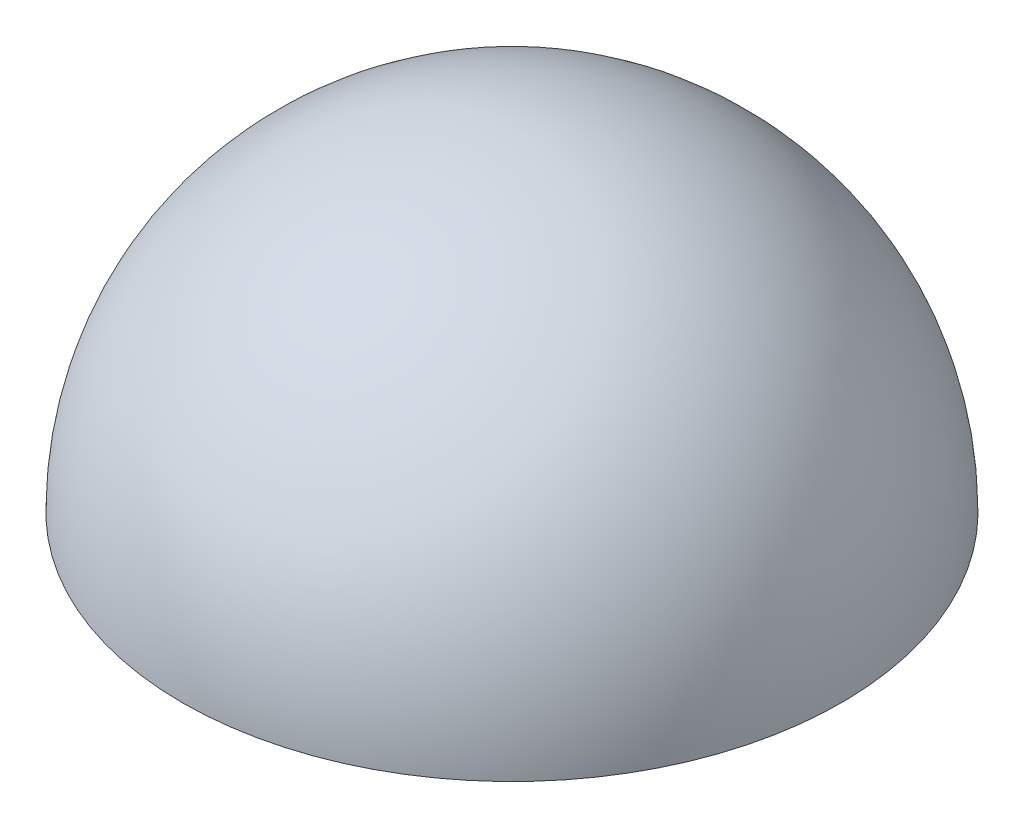
ISO-10303-21;
HEADER;
FILE_DESCRIPTION(('STEP AP214'),'2;1');
FILE_NAME('part.step','',(''),(''),'','','');
FILE_SCHEMA(('AUTOMOTIVE_DESIGN { 1 0 10303 214 1 1 1 1 }'));
ENDSEC;
DATA;
#1=APPLICATION_CONTEXT('core data for automotive mechanical design processes');
#2=APPLICATION_PROTOCOL_DEFINITION('international standard','automotive_design',2000,#1);
#3=PRODUCT_CONTEXT('',#1,'mechanical');
#4=PRODUCT('Part','Part','',(#3));
#5=PRODUCT_RELATED_PRODUCT_CATEGORY('part','',(#4));
#6=PRODUCT_DEFINITION_FORMATION('','',#4);
#7=PRODUCT_DEFINITION_CONTEXT('part definition',#1,'design');
#8=PRODUCT_DEFINITION('design','',#6,#7);
#9=PRODUCT_DEFINITION_SHAPE('','',#8);
#10=(LENGTH_UNIT() NAMED_UNIT(*) SI_UNIT(.MILLI.,.METRE.));
#11=(NAMED_UNIT(*) PLANE_ANGLE_UNIT() SI_UNIT($,.RADIAN.));
#12=(NAMED_UNIT(*) SI_UNIT($,.STERADIAN.) SOLID_ANGLE_UNIT());
#13=UNCERTAINTY_MEASURE_WITH_UNIT(LENGTH_MEASURE(1.E-05),#10,'distance_accuracy_value','');
#14=(GEOMETRIC_REPRESENTATION_CONTEXT(3) GLOBAL_UNCERTAINTY_ASSIGNED_CONTEXT((#13)) GLOBAL_UNIT_ASSIGNED_CONTEXT((#10,
#11,#12)) REPRESENTATION_CONTEXT('',''));
#15=CARTESIAN_POINT('',(0.,0.,0.));
#16=DIRECTION('',(0.,0.,1.));
#17=DIRECTION('',(1.,0.,0.));
#18=AXIS2_PLACEMENT_3D('',#15,#16,#17);
#19=CARTESIAN_POINT('',(0.,0.,0.));
#20=DIRECTION('',(-1.,0.,0.));
#21=DIRECTION('',(0.,1.,0.));
#22=AXIS2_PLACEMENT_3D('',#19,#20,#21);
#23=SPHERICAL_SURFACE('',#22,50.);
#24=CARTESIAN_POINT('',(0.,0.,0.));
#25=DIRECTION('',(0.,1.,0.));
#26=DIRECTION('',(0.,0.,1.));
#27=AXIS2_PLACEMENT_3D('',#24,#25,#26);
#28=SPHERICAL_SURFACE('',#27,50.);
#29=CARTESIAN_POINT('',(0.,0.,0.));
#30=DIRECTION('',(0.,1.,0.));
#31=DIRECTION('',(0.,0.,1.));
#32=AXIS2_PLACEMENT_3D('',#29,#30,#31);
#33=CIRCLE('',#32,50.);
#34=CARTESIAN_POINT('',(0.,0.,50.));
#35=VERTEX_POINT('',#34);
#36=EDGE_CURVE('E10',#35,#35,#33,.T.);
#37=ORIENTED_EDGE('',*,*,#36,.T.);
#38=EDGE_LOOP('',(#37));
#39=FACE_BOUND('',#38,.T.);
#40=ADVANCED_FACE('F39',(#39),#28,.T.);
#41=CARTESIAN_POINT('',(-63.0643694772417,0.,-50.));
#42=DIRECTION('',(0.,1.,0.));
#43=DIRECTION('',(0.,0.,1.));
#44=AXIS2_PLACEMENT_3D('',#41,#42,#43);
#45=PLANE('',#44);
#46=CARTESIAN_POINT('',(0.,0.,0.));
#47=DIRECTION('',(0.,1.,0.));
#48=DIRECTION('',(0.,0.,1.));
#49=AXIS2_PLACEMENT_3D('',#46,#47,#48);
#50=CIRCLE('',#49,40.);
#51=CARTESIAN_POINT('',(0.,0.,40.));
#52=VERTEX_POINT('',#51);
#53=EDGE_CURVE('E45',#52,#52,#50,.T.);
#54=ORIENTED_EDGE('',*,*,#53,.T.);
#55=EDGE_LOOP('',(#54));
#56=FACE_BOUND('',#55,.T.);
#57=ORIENTED_EDGE('',*,*,#36,.F.);
#58=EDGE_LOOP('',(#57));
#59=FACE_BOUND('',#58,.T.);
#60=ADVANCED_FACE('F51',(#56,#59),#45,.F.);
#61=CARTESIAN_POINT('',(0.,0.,0.));
#62=DIRECTION('',(-1.,0.,0.));
#63=DIRECTION('',(0.,1.,0.));
#64=AXIS2_PLACEMENT_3D('',#61,#62,#63);
#65=SPHERICAL_SURFACE('',#64,40.);
#66=CARTESIAN_POINT('',(0.,0.,0.));
#67=DIRECTION('',(0.,1.,0.));
#68=DIRECTION('',(0.,0.,1.));
#69=AXIS2_PLACEMENT_3D('',#66,#67,#68);
#70=SPHERICAL_SURFACE('',#69,40.);
#71=ORIENTED_EDGE('',*,*,#53,.F.);
#72=EDGE_LOOP('',(#71));
#73=FACE_BOUND('',#72,.T.);
#74=ADVANCED_FACE('F54',(#73),#70,.F.);
#75=CLOSED_SHELL('',(#40,#60,#74));
#76=MANIFOLD_SOLID_BREP('B2',#75);
#77=ADVANCED_BREP_SHAPE_REPRESENTATION('',(#18,#76),#14);
#78=SHAPE_DEFINITION_REPRESENTATION(#9,#77);
ENDSEC;
END-ISO-10303-21;
